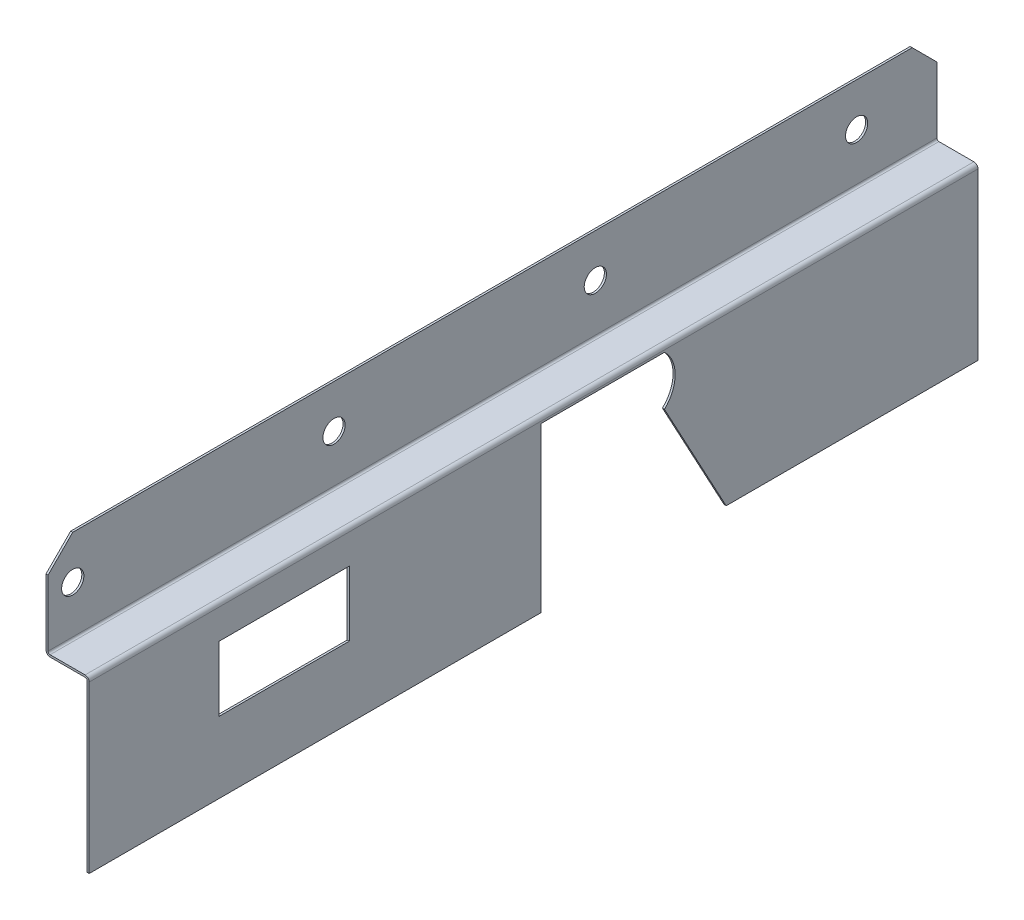
ISO-10303-21;
HEADER;
FILE_DESCRIPTION(('STEP AP214'),'2;1');
FILE_NAME('part.step','',(''),(''),'','','');
FILE_SCHEMA(('AUTOMOTIVE_DESIGN { 1 0 10303 214 1 1 1 1 }'));
ENDSEC;
DATA;
#1=APPLICATION_CONTEXT('core data for automotive mechanical design processes');
#2=APPLICATION_PROTOCOL_DEFINITION('international standard','automotive_design',2000,#1);
#3=PRODUCT_CONTEXT('',#1,'mechanical');
#4=PRODUCT('Part','Part','',(#3));
#5=PRODUCT_RELATED_PRODUCT_CATEGORY('part','',(#4));
#6=PRODUCT_DEFINITION_FORMATION('','',#4);
#7=PRODUCT_DEFINITION_CONTEXT('part definition',#1,'design');
#8=PRODUCT_DEFINITION('design','',#6,#7);
#9=PRODUCT_DEFINITION_SHAPE('','',#8);
#10=(LENGTH_UNIT() NAMED_UNIT(*) SI_UNIT(.MILLI.,.METRE.));
#11=(NAMED_UNIT(*) PLANE_ANGLE_UNIT() SI_UNIT($,.RADIAN.));
#12=(NAMED_UNIT(*) SI_UNIT($,.STERADIAN.) SOLID_ANGLE_UNIT());
#13=UNCERTAINTY_MEASURE_WITH_UNIT(LENGTH_MEASURE(1.E-05),#10,'distance_accuracy_value','');
#14=(GEOMETRIC_REPRESENTATION_CONTEXT(3) GLOBAL_UNCERTAINTY_ASSIGNED_CONTEXT((#13)) GLOBAL_UNIT_ASSIGNED_CONTEXT((#10,
#11,#12)) REPRESENTATION_CONTEXT('',''));
#15=CARTESIAN_POINT('',(0.,0.,0.));
#16=DIRECTION('',(0.,0.,1.));
#17=DIRECTION('',(1.,0.,0.));
#18=AXIS2_PLACEMENT_3D('',#15,#16,#17);
#19=CARTESIAN_POINT('',(0.5,0.5,0.));
#20=DIRECTION('',(0.,0.,-1.));
#21=DIRECTION('',(-1.,0.,0.));
#22=AXIS2_PLACEMENT_3D('',#19,#20,#21);
#23=CYLINDRICAL_SURFACE('',#22,1.);
#24=DIRECTION('',(0.,0.,-1.));
#25=VECTOR('',#24,1.);
#26=CARTESIAN_POINT('',(0.5,-0.5,-108.));
#27=LINE('',#26,#25);
#28=CARTESIAN_POINT('',(0.5,-0.5,108.));
#29=VERTEX_POINT('',#28);
#30=CARTESIAN_POINT('',(0.5,-0.5,-108.));
#31=VERTEX_POINT('',#30);
#32=EDGE_CURVE('E175',#29,#31,#27,.T.);
#33=ORIENTED_EDGE('',*,*,#32,.F.);
#34=CARTESIAN_POINT('',(0.5,0.5,108.));
#35=DIRECTION('',(0.,0.,-1.));
#36=DIRECTION('',(-1.,0.,0.));
#37=AXIS2_PLACEMENT_3D('',#34,#35,#36);
#38=CIRCLE('',#37,1.);
#39=CARTESIAN_POINT('',(-0.5,0.5,108.));
#40=VERTEX_POINT('',#39);
#41=EDGE_CURVE('E180',#29,#40,#38,.T.);
#42=ORIENTED_EDGE('',*,*,#41,.T.);
#43=DIRECTION('',(0.,0.,1.));
#44=VECTOR('',#43,1.);
#45=CARTESIAN_POINT('',(-0.5,0.5,-108.));
#46=LINE('',#45,#44);
#47=CARTESIAN_POINT('',(-0.5,0.5,-108.));
#48=VERTEX_POINT('',#47);
#49=EDGE_CURVE('E178',#48,#40,#46,.T.);
#50=ORIENTED_EDGE('',*,*,#49,.F.);
#51=CARTESIAN_POINT('',(0.5,0.5,-108.));
#52=DIRECTION('',(0.,0.,-1.));
#53=DIRECTION('',(-1.,0.,0.));
#54=AXIS2_PLACEMENT_3D('',#51,#52,#53);
#55=CIRCLE('',#54,1.);
#56=EDGE_CURVE('E21',#48,#31,#55,.F.);
#57=ORIENTED_EDGE('',*,*,#56,.T.);
#58=EDGE_LOOP('',(#33,#42,#50,#57));
#59=FACE_BOUND('',#58,.T.);
#60=ADVANCED_FACE('F17',(#59),#23,.T.);
#61=CARTESIAN_POINT('',(2.73990850376749,19.52,105.));
#62=DIRECTION('',(0.,0.707106781186549,0.707106781186546));
#63=DIRECTION('',(0.,-0.707106781186546,0.707106781186549));
#64=AXIS2_PLACEMENT_3D('',#61,#62,#63);
#65=PLANE('',#64);
#66=DIRECTION('',(0.,0.707106781186549,-0.707106781186546));
#67=VECTOR('',#66,1.);
#68=CARTESIAN_POINT('',(-0.5,16.52,108.));
#69=LINE('',#68,#67);
#70=CARTESIAN_POINT('',(-0.5,16.52,108.));
#71=VERTEX_POINT('',#70);
#72=CARTESIAN_POINT('',(-0.5,22.52,102.));
#73=VERTEX_POINT('',#72);
#74=EDGE_CURVE('E283',#71,#73,#69,.T.);
#75=ORIENTED_EDGE('',*,*,#74,.F.);
#76=DIRECTION('',(1.,0.,0.));
#77=VECTOR('',#76,1.);
#78=CARTESIAN_POINT('',(2.73990850376749,16.52,108.));
#79=LINE('',#78,#77);
#80=CARTESIAN_POINT('',(0.,16.52,108.));
#81=VERTEX_POINT('',#80);
#82=EDGE_CURVE('E326',#71,#81,#79,.T.);
#83=ORIENTED_EDGE('',*,*,#82,.T.);
#84=DIRECTION('',(0.,-0.707106781186549,0.707106781186546));
#85=VECTOR('',#84,1.);
#86=CARTESIAN_POINT('',(0.,22.52,102.));
#87=LINE('',#86,#85);
#88=CARTESIAN_POINT('',(0.,22.52,102.));
#89=VERTEX_POINT('',#88);
#90=EDGE_CURVE('E264',#89,#81,#87,.T.);
#91=ORIENTED_EDGE('',*,*,#90,.F.);
#92=DIRECTION('',(1.,0.,0.));
#93=VECTOR('',#92,1.);
#94=CARTESIAN_POINT('',(-0.5,22.52,102.));
#95=LINE('',#94,#93);
#96=EDGE_CURVE('E312',#73,#89,#95,.T.);
#97=ORIENTED_EDGE('',*,*,#96,.F.);
#98=EDGE_LOOP('',(#75,#83,#91,#97));
#99=FACE_BOUND('',#98,.T.);
#100=ADVANCED_FACE('F687',(#99),#65,.T.);
#101=CARTESIAN_POINT('',(0.5,0.5,0.));
#102=DIRECTION('',(0.,0.,-1.));
#103=DIRECTION('',(-1.,0.,0.));
#104=AXIS2_PLACEMENT_3D('',#101,#102,#103);
#105=CYLINDRICAL_SURFACE('',#104,0.5);
#106=CARTESIAN_POINT('',(0.5,0.5,108.));
#107=DIRECTION('',(0.,0.,-1.));
#108=DIRECTION('',(-1.,0.,0.));
#109=AXIS2_PLACEMENT_3D('',#106,#107,#108);
#110=CIRCLE('',#109,0.5);
#111=CARTESIAN_POINT('',(0.5,0.,108.));
#112=VERTEX_POINT('',#111);
#113=CARTESIAN_POINT('',(0.,0.5,108.));
#114=VERTEX_POINT('',#113);
#115=EDGE_CURVE('E313',#112,#114,#110,.T.);
#116=ORIENTED_EDGE('',*,*,#115,.F.);
#117=DIRECTION('',(0.,0.,1.));
#118=VECTOR('',#117,1.);
#119=CARTESIAN_POINT('',(0.5,0.,-108.));
#120=LINE('',#119,#118);
#121=CARTESIAN_POINT('',(0.5,0.,-108.));
#122=VERTEX_POINT('',#121);
#123=EDGE_CURVE('E188',#122,#112,#120,.T.);
#124=ORIENTED_EDGE('',*,*,#123,.F.);
#125=CARTESIAN_POINT('',(0.5,0.5,-108.));
#126=DIRECTION('',(0.,0.,-1.));
#127=DIRECTION('',(-1.,0.,0.));
#128=AXIS2_PLACEMENT_3D('',#125,#126,#127);
#129=CIRCLE('',#128,0.5);
#130=CARTESIAN_POINT('',(0.,0.5,-108.));
#131=VERTEX_POINT('',#130);
#132=EDGE_CURVE('E328',#131,#122,#129,.F.);
#133=ORIENTED_EDGE('',*,*,#132,.F.);
#134=DIRECTION('',(0.,0.,-1.));
#135=VECTOR('',#134,1.);
#136=CARTESIAN_POINT('',(0.,0.5,-108.));
#137=LINE('',#136,#135);
#138=EDGE_CURVE('E260',#114,#131,#137,.T.);
#139=ORIENTED_EDGE('',*,*,#138,.F.);
#140=EDGE_LOOP('',(#116,#124,#133,#139));
#141=FACE_BOUND('',#140,.T.);
#142=ADVANCED_FACE('F679',(#141),#105,.F.);
#143=CARTESIAN_POINT('',(2.73990850376749,19.52,-105.));
#144=DIRECTION('',(0.,0.707106781186546,-0.707106781186549));
#145=DIRECTION('',(0.,0.707106781186549,0.707106781186546));
#146=AXIS2_PLACEMENT_3D('',#143,#144,#145);
#147=PLANE('',#146);
#148=DIRECTION('',(0.,-0.707106781186548,-0.707106781186547));
#149=VECTOR('',#148,1.);
#150=CARTESIAN_POINT('',(-0.5,22.52,-102.));
#151=LINE('',#150,#149);
#152=CARTESIAN_POINT('',(-0.5,22.52,-102.));
#153=VERTEX_POINT('',#152);
#154=CARTESIAN_POINT('',(-0.5,16.52,-108.));
#155=VERTEX_POINT('',#154);
#156=EDGE_CURVE('E282',#153,#155,#151,.T.);
#157=ORIENTED_EDGE('',*,*,#156,.F.);
#158=DIRECTION('',(1.,0.,0.));
#159=VECTOR('',#158,1.);
#160=CARTESIAN_POINT('',(-0.5,22.52,-102.));
#161=LINE('',#160,#159);
#162=CARTESIAN_POINT('',(0.,22.52,-102.));
#163=VERTEX_POINT('',#162);
#164=EDGE_CURVE('E321',#163,#153,#161,.F.);
#165=ORIENTED_EDGE('',*,*,#164,.F.);
#166=DIRECTION('',(0.,0.707106781186548,0.707106781186547));
#167=VECTOR('',#166,1.);
#168=CARTESIAN_POINT('',(0.,16.52,-108.));
#169=LINE('',#168,#167);
#170=CARTESIAN_POINT('',(0.,16.52,-108.));
#171=VERTEX_POINT('',#170);
#172=EDGE_CURVE('E263',#171,#163,#169,.T.);
#173=ORIENTED_EDGE('',*,*,#172,.F.);
#174=DIRECTION('',(1.,0.,0.));
#175=VECTOR('',#174,1.);
#176=CARTESIAN_POINT('',(2.73990850376749,16.52,-108.));
#177=LINE('',#176,#175);
#178=EDGE_CURVE('E310',#171,#155,#177,.F.);
#179=ORIENTED_EDGE('',*,*,#178,.T.);
#180=EDGE_LOOP('',(#157,#165,#173,#179));
#181=FACE_BOUND('',#180,.T.);
#182=ADVANCED_FACE('F671',(#181),#147,.T.);
#183=CARTESIAN_POINT('',(-0.5,22.52,-108.));
#184=DIRECTION('',(0.,1.,0.));
#185=DIRECTION('',(0.,0.,1.));
#186=AXIS2_PLACEMENT_3D('',#183,#184,#185);
#187=PLANE('',#186);
#188=ORIENTED_EDGE('',*,*,#164,.T.);
#189=DIRECTION('',(0.,0.,1.));
#190=VECTOR('',#189,1.);
#191=CARTESIAN_POINT('',(-0.5,22.52,-108.));
#192=LINE('',#191,#190);
#193=EDGE_CURVE('E286',#73,#153,#192,.F.);
#194=ORIENTED_EDGE('',*,*,#193,.F.);
#195=ORIENTED_EDGE('',*,*,#96,.T.);
#196=DIRECTION('',(0.,0.,-1.));
#197=VECTOR('',#196,1.);
#198=CARTESIAN_POINT('',(0.,22.52,-108.));
#199=LINE('',#198,#197);
#200=EDGE_CURVE('E291',#163,#89,#199,.F.);
#201=ORIENTED_EDGE('',*,*,#200,.F.);
#202=EDGE_LOOP('',(#188,#194,#195,#201));
#203=FACE_BOUND('',#202,.T.);
#204=ADVANCED_FACE('F663',(#203),#187,.T.);
#205=CARTESIAN_POINT('',(0.,12.02,-88.5));
#206=DIRECTION('',(-1.,0.,0.));
#207=DIRECTION('',(0.,0.,1.));
#208=AXIS2_PLACEMENT_3D('',#205,#206,#207);
#209=CYLINDRICAL_SURFACE('',#208,2.7);
#210=CARTESIAN_POINT('',(-0.5,12.02,-88.5));
#211=DIRECTION('',(-1.,0.,0.));
#212=DIRECTION('',(0.,0.,1.));
#213=AXIS2_PLACEMENT_3D('',#210,#211,#212);
#214=CIRCLE('',#213,2.7);
#215=CARTESIAN_POINT('',(-0.5,12.02,-85.8));
#216=VERTEX_POINT('',#215);
#217=EDGE_CURVE('E281',#216,#216,#214,.F.);
#218=ORIENTED_EDGE('',*,*,#217,.F.);
#219=EDGE_LOOP('',(#218));
#220=FACE_BOUND('',#219,.T.);
#221=CARTESIAN_POINT('',(0.,12.02,-88.5));
#222=DIRECTION('',(-1.,0.,0.));
#223=DIRECTION('',(0.,0.,1.));
#224=AXIS2_PLACEMENT_3D('',#221,#222,#223);
#225=CIRCLE('',#224,2.7);
#226=CARTESIAN_POINT('',(0.,12.02,-85.8));
#227=VERTEX_POINT('',#226);
#228=EDGE_CURVE('E318',#227,#227,#225,.T.);
#229=ORIENTED_EDGE('',*,*,#228,.F.);
#230=EDGE_LOOP('',(#229));
#231=FACE_BOUND('',#230,.T.);
#232=ADVANCED_FACE('F655',(#220,#231),#209,.F.);
#233=CARTESIAN_POINT('',(0.,12.02,-25.));
#234=DIRECTION('',(-1.,0.,0.));
#235=DIRECTION('',(0.,0.,1.));
#236=AXIS2_PLACEMENT_3D('',#233,#234,#235);
#237=CYLINDRICAL_SURFACE('',#236,2.7);
#238=CARTESIAN_POINT('',(-0.5,12.02,-25.));
#239=DIRECTION('',(-1.,0.,0.));
#240=DIRECTION('',(0.,0.,1.));
#241=AXIS2_PLACEMENT_3D('',#238,#239,#240);
#242=CIRCLE('',#241,2.7);
#243=CARTESIAN_POINT('',(-0.5,12.02,-22.3));
#244=VERTEX_POINT('',#243);
#245=EDGE_CURVE('E367',#244,#244,#242,.F.);
#246=ORIENTED_EDGE('',*,*,#245,.F.);
#247=EDGE_LOOP('',(#246));
#248=FACE_BOUND('',#247,.T.);
#249=CARTESIAN_POINT('',(0.,12.02,-25.));
#250=DIRECTION('',(-1.,0.,0.));
#251=DIRECTION('',(0.,0.,1.));
#252=AXIS2_PLACEMENT_3D('',#249,#250,#251);
#253=CIRCLE('',#252,2.7);
#254=CARTESIAN_POINT('',(0.,12.02,-22.3));
#255=VERTEX_POINT('',#254);
#256=EDGE_CURVE('E357',#255,#255,#253,.T.);
#257=ORIENTED_EDGE('',*,*,#256,.F.);
#258=EDGE_LOOP('',(#257));
#259=FACE_BOUND('',#258,.T.);
#260=ADVANCED_FACE('F648',(#248,#259),#237,.F.);
#261=CARTESIAN_POINT('',(0.,12.02,38.5));
#262=DIRECTION('',(-1.,0.,0.));
#263=DIRECTION('',(0.,0.,1.));
#264=AXIS2_PLACEMENT_3D('',#261,#262,#263);
#265=CYLINDRICAL_SURFACE('',#264,2.7);
#266=CARTESIAN_POINT('',(-0.5,12.02,38.5));
#267=DIRECTION('',(-1.,0.,0.));
#268=DIRECTION('',(0.,0.,1.));
#269=AXIS2_PLACEMENT_3D('',#266,#267,#268);
#270=CIRCLE('',#269,2.7);
#271=CARTESIAN_POINT('',(-0.5,12.02,41.2));
#272=VERTEX_POINT('',#271);
#273=EDGE_CURVE('E364',#272,#272,#270,.F.);
#274=ORIENTED_EDGE('',*,*,#273,.F.);
#275=EDGE_LOOP('',(#274));
#276=FACE_BOUND('',#275,.T.);
#277=CARTESIAN_POINT('',(0.,12.02,38.5));
#278=DIRECTION('',(-1.,0.,0.));
#279=DIRECTION('',(0.,0.,1.));
#280=AXIS2_PLACEMENT_3D('',#277,#278,#279);
#281=CIRCLE('',#280,2.7);
#282=CARTESIAN_POINT('',(0.,12.02,41.2));
#283=VERTEX_POINT('',#282);
#284=EDGE_CURVE('E354',#283,#283,#281,.T.);
#285=ORIENTED_EDGE('',*,*,#284,.F.);
#286=EDGE_LOOP('',(#285));
#287=FACE_BOUND('',#286,.T.);
#288=ADVANCED_FACE('F641',(#276,#287),#265,.F.);
#289=CARTESIAN_POINT('',(0.,12.02,102.));
#290=DIRECTION('',(-1.,0.,0.));
#291=DIRECTION('',(0.,0.,1.));
#292=AXIS2_PLACEMENT_3D('',#289,#290,#291);
#293=CYLINDRICAL_SURFACE('',#292,2.7);
#294=CARTESIAN_POINT('',(-0.5,12.02,102.));
#295=DIRECTION('',(-1.,0.,0.));
#296=DIRECTION('',(0.,0.,1.));
#297=AXIS2_PLACEMENT_3D('',#294,#295,#296);
#298=CIRCLE('',#297,2.7);
#299=CARTESIAN_POINT('',(-0.5,12.02,104.7));
#300=VERTEX_POINT('',#299);
#301=EDGE_CURVE('E279',#300,#300,#298,.F.);
#302=ORIENTED_EDGE('',*,*,#301,.F.);
#303=EDGE_LOOP('',(#302));
#304=FACE_BOUND('',#303,.T.);
#305=CARTESIAN_POINT('',(0.,12.02,102.));
#306=DIRECTION('',(-1.,0.,0.));
#307=DIRECTION('',(0.,0.,1.));
#308=AXIS2_PLACEMENT_3D('',#305,#306,#307);
#309=CIRCLE('',#308,2.7);
#310=CARTESIAN_POINT('',(0.,12.02,104.7));
#311=VERTEX_POINT('',#310);
#312=EDGE_CURVE('E276',#311,#311,#309,.T.);
#313=ORIENTED_EDGE('',*,*,#312,.F.);
#314=EDGE_LOOP('',(#313));
#315=FACE_BOUND('',#314,.T.);
#316=ADVANCED_FACE('F19',(#304,#315),#293,.F.);
#317=CARTESIAN_POINT('',(9.,-1.,0.));
#318=DIRECTION('',(0.,0.,1.));
#319=DIRECTION('',(1.,0.,0.));
#320=AXIS2_PLACEMENT_3D('',#317,#318,#319);
#321=CYLINDRICAL_SURFACE('',#320,0.5);
#322=CARTESIAN_POINT('',(9.,-1.,-108.));
#323=DIRECTION('',(0.,0.,1.));
#324=DIRECTION('',(1.,0.,0.));
#325=AXIS2_PLACEMENT_3D('',#322,#323,#324);
#326=CIRCLE('',#325,0.5);
#327=CARTESIAN_POINT('',(9.5,-1.,-108.));
#328=VERTEX_POINT('',#327);
#329=CARTESIAN_POINT('',(9.,-0.5,-108.));
#330=VERTEX_POINT('',#329);
#331=EDGE_CURVE('E194',#328,#330,#326,.T.);
#332=ORIENTED_EDGE('',*,*,#331,.F.);
#333=DIRECTION('',(0.,0.,1.));
#334=VECTOR('',#333,1.);
#335=CARTESIAN_POINT('',(9.5,-1.,-108.));
#336=LINE('',#335,#334);
#337=CARTESIAN_POINT('',(9.5,-1.,108.));
#338=VERTEX_POINT('',#337);
#339=EDGE_CURVE('E257',#338,#328,#336,.F.);
#340=ORIENTED_EDGE('',*,*,#339,.F.);
#341=CARTESIAN_POINT('',(9.,-1.,108.));
#342=DIRECTION('',(0.,0.,1.));
#343=DIRECTION('',(1.,0.,0.));
#344=AXIS2_PLACEMENT_3D('',#341,#342,#343);
#345=CIRCLE('',#344,0.5);
#346=CARTESIAN_POINT('',(9.,-0.5,108.));
#347=VERTEX_POINT('',#346);
#348=EDGE_CURVE('E323',#347,#338,#345,.F.);
#349=ORIENTED_EDGE('',*,*,#348,.F.);
#350=DIRECTION('',(0.,0.,-1.));
#351=VECTOR('',#350,1.);
#352=CARTESIAN_POINT('',(9.,-0.5,-108.));
#353=LINE('',#352,#351);
#354=EDGE_CURVE('E189',#330,#347,#353,.F.);
#355=ORIENTED_EDGE('',*,*,#354,.F.);
#356=EDGE_LOOP('',(#332,#340,#349,#355));
#357=FACE_BOUND('',#356,.T.);
#358=ADVANCED_FACE('F442',(#357),#321,.F.);
#359=CARTESIAN_POINT('',(-0.5,-0.5,-108.));
#360=DIRECTION('',(-1.,0.,0.));
#361=DIRECTION('',(0.,0.,1.));
#362=AXIS2_PLACEMENT_3D('',#359,#360,#361);
#363=PLANE('',#362);
#364=ORIENTED_EDGE('',*,*,#301,.T.);
#365=EDGE_LOOP('',(#364));
#366=FACE_BOUND('',#365,.T.);
#367=ORIENTED_EDGE('',*,*,#273,.T.);
#368=EDGE_LOOP('',(#367));
#369=FACE_BOUND('',#368,.T.);
#370=ORIENTED_EDGE('',*,*,#245,.T.);
#371=EDGE_LOOP('',(#370));
#372=FACE_BOUND('',#371,.T.);
#373=ORIENTED_EDGE('',*,*,#217,.T.);
#374=EDGE_LOOP('',(#373));
#375=FACE_BOUND('',#374,.T.);
#376=ORIENTED_EDGE('',*,*,#49,.T.);
#377=DIRECTION('',(0.,1.,0.));
#378=VECTOR('',#377,1.);
#379=CARTESIAN_POINT('',(-0.5,-8.16018299246501,108.));
#380=LINE('',#379,#378);
#381=EDGE_CURVE('E349',#71,#40,#380,.F.);
#382=ORIENTED_EDGE('',*,*,#381,.F.);
#383=ORIENTED_EDGE('',*,*,#74,.T.);
#384=ORIENTED_EDGE('',*,*,#193,.T.);
#385=ORIENTED_EDGE('',*,*,#156,.T.);
#386=DIRECTION('',(0.,1.,0.));
#387=VECTOR('',#386,1.);
#388=CARTESIAN_POINT('',(-0.5,-8.16018299246501,-108.));
#389=LINE('',#388,#387);
#390=EDGE_CURVE('E197',#155,#48,#389,.F.);
#391=ORIENTED_EDGE('',*,*,#390,.T.);
#392=EDGE_LOOP('',(#376,#382,#383,#384,#385,#391));
#393=FACE_BOUND('',#392,.T.);
#394=ADVANCED_FACE('F379',(#366,#369,#372,#375,#393),#363,.T.);
#395=CARTESIAN_POINT('',(9.5,-0.5,-108.));
#396=DIRECTION('',(0.,-1.,0.));
#397=DIRECTION('',(0.,0.,-1.));
#398=AXIS2_PLACEMENT_3D('',#395,#396,#397);
#399=PLANE('',#398);
#400=ORIENTED_EDGE('',*,*,#32,.T.);
#401=DIRECTION('',(1.,0.,0.));
#402=VECTOR('',#401,1.);
#403=CARTESIAN_POINT('',(5.97981700753498,-0.5,-108.));
#404=LINE('',#403,#402);
#405=EDGE_CURVE('E185',#31,#330,#404,.T.);
#406=ORIENTED_EDGE('',*,*,#405,.T.);
#407=ORIENTED_EDGE('',*,*,#354,.T.);
#408=DIRECTION('',(1.,0.,0.));
#409=VECTOR('',#408,1.);
#410=CARTESIAN_POINT('',(5.97981700753498,-0.5,108.));
#411=LINE('',#410,#409);
#412=EDGE_CURVE('E187',#29,#347,#411,.T.);
#413=ORIENTED_EDGE('',*,*,#412,.F.);
#414=EDGE_LOOP('',(#400,#406,#407,#413));
#415=FACE_BOUND('',#414,.T.);
#416=ADVANCED_FACE('F183',(#415),#399,.T.);
#417=CARTESIAN_POINT('',(0.,0.,-108.));
#418=DIRECTION('',(0.,1.,0.));
#419=DIRECTION('',(0.,0.,1.));
#420=AXIS2_PLACEMENT_3D('',#417,#418,#419);
#421=PLANE('',#420);
#422=ORIENTED_EDGE('',*,*,#123,.T.);
#423=DIRECTION('',(1.,0.,0.));
#424=VECTOR('',#423,1.);
#425=CARTESIAN_POINT('',(5.97981700753498,0.,108.));
#426=LINE('',#425,#424);
#427=CARTESIAN_POINT('',(9.,0.,108.));
#428=VERTEX_POINT('',#427);
#429=EDGE_CURVE('E345',#428,#112,#426,.F.);
#430=ORIENTED_EDGE('',*,*,#429,.F.);
#431=DIRECTION('',(0.,0.,1.));
#432=VECTOR('',#431,1.);
#433=CARTESIAN_POINT('',(9.,0.,0.));
#434=LINE('',#433,#432);
#435=CARTESIAN_POINT('',(9.,0.,-108.));
#436=VERTEX_POINT('',#435);
#437=EDGE_CURVE('E271',#436,#428,#434,.T.);
#438=ORIENTED_EDGE('',*,*,#437,.F.);
#439=DIRECTION('',(1.,0.,0.));
#440=VECTOR('',#439,1.);
#441=CARTESIAN_POINT('',(5.97981700753498,0.,-108.));
#442=LINE('',#441,#440);
#443=EDGE_CURVE('E209',#436,#122,#442,.F.);
#444=ORIENTED_EDGE('',*,*,#443,.T.);
#445=EDGE_LOOP('',(#422,#430,#438,#444));
#446=FACE_BOUND('',#445,.T.);
#447=ADVANCED_FACE('F418',(#446),#421,.T.);
#448=CARTESIAN_POINT('',(0.,22.52,-108.));
#449=DIRECTION('',(1.,0.,0.));
#450=DIRECTION('',(0.,0.,-1.));
#451=AXIS2_PLACEMENT_3D('',#448,#449,#450);
#452=PLANE('',#451);
#453=ORIENTED_EDGE('',*,*,#312,.T.);
#454=EDGE_LOOP('',(#453));
#455=FACE_BOUND('',#454,.T.);
#456=ORIENTED_EDGE('',*,*,#284,.T.);
#457=EDGE_LOOP('',(#456));
#458=FACE_BOUND('',#457,.T.);
#459=ORIENTED_EDGE('',*,*,#256,.T.);
#460=EDGE_LOOP('',(#459));
#461=FACE_BOUND('',#460,.T.);
#462=ORIENTED_EDGE('',*,*,#228,.T.);
#463=EDGE_LOOP('',(#462));
#464=FACE_BOUND('',#463,.T.);
#465=ORIENTED_EDGE('',*,*,#172,.T.);
#466=ORIENTED_EDGE('',*,*,#200,.T.);
#467=ORIENTED_EDGE('',*,*,#90,.T.);
#468=DIRECTION('',(0.,1.,0.));
#469=VECTOR('',#468,1.);
#470=CARTESIAN_POINT('',(0.,-8.16018299246501,108.));
#471=LINE('',#470,#469);
#472=EDGE_CURVE('E247',#114,#81,#471,.T.);
#473=ORIENTED_EDGE('',*,*,#472,.F.);
#474=ORIENTED_EDGE('',*,*,#138,.T.);
#475=DIRECTION('',(0.,1.,0.));
#476=VECTOR('',#475,1.);
#477=CARTESIAN_POINT('',(0.,-8.16018299246501,-108.));
#478=LINE('',#477,#476);
#479=EDGE_CURVE('E274',#131,#171,#478,.T.);
#480=ORIENTED_EDGE('',*,*,#479,.T.);
#481=EDGE_LOOP('',(#465,#466,#467,#473,#474,#480));
#482=FACE_BOUND('',#481,.T.);
#483=ADVANCED_FACE('F602',(#455,#458,#461,#464,#482),#452,.T.);
#484=CARTESIAN_POINT('',(9.5,-41.3,-108.));
#485=DIRECTION('',(-1.,0.,0.));
#486=DIRECTION('',(0.,0.,1.));
#487=AXIS2_PLACEMENT_3D('',#484,#485,#486);
#488=PLANE('',#487);
#489=DIRECTION('',(0.,1.,0.));
#490=VECTOR('',#489,1.);
#491=CARTESIAN_POINT('',(9.5,-24.,44.8));
#492=LINE('',#491,#490);
#493=CARTESIAN_POINT('',(9.5,-24.,44.8));
#494=VERTEX_POINT('',#493);
#495=CARTESIAN_POINT('',(9.5,-8.19999999999999,44.8));
#496=VERTEX_POINT('',#495);
#497=EDGE_CURVE('E463',#494,#496,#492,.T.);
#498=ORIENTED_EDGE('',*,*,#497,.T.);
#499=DIRECTION('',(0.,0.,1.));
#500=VECTOR('',#499,1.);
#501=CARTESIAN_POINT('',(9.5,-8.19999999999999,44.8));
#502=LINE('',#501,#500);
#503=CARTESIAN_POINT('',(9.5,-8.19999999999999,76.4));
#504=VERTEX_POINT('',#503);
#505=EDGE_CURVE('E458',#496,#504,#502,.T.);
#506=ORIENTED_EDGE('',*,*,#505,.T.);
#507=DIRECTION('',(0.,1.,0.));
#508=VECTOR('',#507,1.);
#509=CARTESIAN_POINT('',(9.5,-8.19999999999999,76.4));
#510=LINE('',#509,#508);
#511=CARTESIAN_POINT('',(9.5,-24.,76.4));
#512=VERTEX_POINT('',#511);
#513=EDGE_CURVE('E253',#504,#512,#510,.F.);
#514=ORIENTED_EDGE('',*,*,#513,.T.);
#515=DIRECTION('',(0.,0.,-1.));
#516=VECTOR('',#515,1.);
#517=CARTESIAN_POINT('',(9.5,-24.,76.4));
#518=LINE('',#517,#516);
#519=EDGE_CURVE('E240',#512,#494,#518,.T.);
#520=ORIENTED_EDGE('',*,*,#519,.T.);
#521=EDGE_LOOP('',(#498,#506,#514,#520));
#522=FACE_BOUND('',#521,.T.);
#523=CARTESIAN_POINT('',(9.5,-7.5,-26.1789230769231));
#524=DIRECTION('',(-1.,0.,0.));
#525=DIRECTION('',(0.,0.,1.));
#526=AXIS2_PLACEMENT_3D('',#523,#524,#525);
#527=CIRCLE('',#526,8.22307692307693);
#528=CARTESIAN_POINT('',(9.5,-13.5,-31.802));
#529=VERTEX_POINT('',#528);
#530=CARTESIAN_POINT('',(9.5,-1.49999999999999,-31.802));
#531=VERTEX_POINT('',#530);
#532=EDGE_CURVE('E227',#529,#531,#527,.F.);
#533=ORIENTED_EDGE('',*,*,#532,.T.);
#534=DIRECTION('',(0.,0.,1.));
#535=VECTOR('',#534,1.);
#536=CARTESIAN_POINT('',(9.5,-1.49999999999999,-31.802));
#537=LINE('',#536,#535);
#538=CARTESIAN_POINT('',(9.5,-1.49999999999999,-1.80199999999999));
#539=VERTEX_POINT('',#538);
#540=EDGE_CURVE('E230',#531,#539,#537,.T.);
#541=ORIENTED_EDGE('',*,*,#540,.T.);
#542=DIRECTION('',(0.,1.,0.));
#543=VECTOR('',#542,1.);
#544=CARTESIAN_POINT('',(9.5,-1.49999999999999,-1.80199999999999));
#545=LINE('',#544,#543);
#546=CARTESIAN_POINT('',(9.5,-41.3,-1.802));
#547=VERTEX_POINT('',#546);
#548=EDGE_CURVE('E233',#539,#547,#545,.F.);
#549=ORIENTED_EDGE('',*,*,#548,.T.);
#550=DIRECTION('',(0.,0.,-1.));
#551=VECTOR('',#550,1.);
#552=CARTESIAN_POINT('',(9.5,-41.3,-108.));
#553=LINE('',#552,#551);
#554=CARTESIAN_POINT('',(9.5,-41.3,108.));
#555=VERTEX_POINT('',#554);
#556=EDGE_CURVE('E250',#555,#547,#553,.T.);
#557=ORIENTED_EDGE('',*,*,#556,.F.);
#558=DIRECTION('',(0.,1.,0.));
#559=VECTOR('',#558,1.);
#560=CARTESIAN_POINT('',(9.5,-8.16018299246501,108.));
#561=LINE('',#560,#559);
#562=EDGE_CURVE('E346',#338,#555,#561,.F.);
#563=ORIENTED_EDGE('',*,*,#562,.F.);
#564=ORIENTED_EDGE('',*,*,#339,.T.);
#565=DIRECTION('',(0.,1.,0.));
#566=VECTOR('',#565,1.);
#567=CARTESIAN_POINT('',(9.5,-8.16018299246501,-108.));
#568=LINE('',#567,#566);
#569=CARTESIAN_POINT('',(9.5,-41.3,-108.));
#570=VERTEX_POINT('',#569);
#571=EDGE_CURVE('E196',#328,#570,#568,.F.);
#572=ORIENTED_EDGE('',*,*,#571,.T.);
#573=DIRECTION('',(0.,0.,-1.));
#574=VECTOR('',#573,1.);
#575=CARTESIAN_POINT('',(9.5,-41.3,-108.));
#576=LINE('',#575,#574);
#577=CARTESIAN_POINT('',(9.5,-41.3,-46.802));
#578=VERTEX_POINT('',#577);
#579=EDGE_CURVE('E201',#578,#570,#576,.T.);
#580=ORIENTED_EDGE('',*,*,#579,.F.);
#581=DIRECTION('',(0.,0.880064172641751,0.474854769411017));
#582=VECTOR('',#581,1.);
#583=CARTESIAN_POINT('',(9.5,-41.3,-46.802));
#584=LINE('',#583,#582);
#585=EDGE_CURVE('E222',#578,#529,#584,.T.);
#586=ORIENTED_EDGE('',*,*,#585,.T.);
#587=EDGE_LOOP('',(#533,#541,#549,#557,#563,#564,#572,#580,#586));
#588=FACE_BOUND('',#587,.T.);
#589=ADVANCED_FACE('F436',(#522,#588),#488,.T.);
#590=CARTESIAN_POINT('',(10.,-1.49999999999999,-1.80199999999999));
#591=DIRECTION('',(0.,0.,1.));
#592=DIRECTION('',(1.,0.,0.));
#593=AXIS2_PLACEMENT_3D('',#590,#591,#592);
#594=PLANE('',#593);
#595=DIRECTION('',(1.,0.,0.));
#596=VECTOR('',#595,1.);
#597=CARTESIAN_POINT('',(10.,-1.49999999999999,-1.80199999999999));
#598=LINE('',#597,#596);
#599=CARTESIAN_POINT('',(10.,-1.49999999999999,-1.802));
#600=VERTEX_POINT('',#599);
#601=EDGE_CURVE('E231',#539,#600,#598,.T.);
#602=ORIENTED_EDGE('',*,*,#601,.T.);
#603=DIRECTION('',(0.,1.,0.));
#604=VECTOR('',#603,1.);
#605=CARTESIAN_POINT('',(10.,0.,-1.802));
#606=LINE('',#605,#604);
#607=CARTESIAN_POINT('',(10.,-41.3,-1.802));
#608=VERTEX_POINT('',#607);
#609=EDGE_CURVE('E236',#608,#600,#606,.T.);
#610=ORIENTED_EDGE('',*,*,#609,.F.);
#611=DIRECTION('',(1.,0.,0.));
#612=VECTOR('',#611,1.);
#613=CARTESIAN_POINT('',(10.,-41.3,-1.802));
#614=LINE('',#613,#612);
#615=EDGE_CURVE('E243',#547,#608,#614,.T.);
#616=ORIENTED_EDGE('',*,*,#615,.F.);
#617=ORIENTED_EDGE('',*,*,#548,.F.);
#618=EDGE_LOOP('',(#602,#610,#616,#617));
#619=FACE_BOUND('',#618,.T.);
#620=ADVANCED_FACE('F587',(#619),#594,.F.);
#621=CARTESIAN_POINT('',(10.,-1.49999999999999,-31.802));
#622=DIRECTION('',(0.,1.,0.));
#623=DIRECTION('',(0.,0.,1.));
#624=AXIS2_PLACEMENT_3D('',#621,#622,#623);
#625=PLANE('',#624);
#626=DIRECTION('',(-1.,0.,0.));
#627=VECTOR('',#626,1.);
#628=CARTESIAN_POINT('',(10.,-1.49999999999999,-31.802));
#629=LINE('',#628,#627);
#630=CARTESIAN_POINT('',(10.,-1.49999999999999,-31.802));
#631=VERTEX_POINT('',#630);
#632=EDGE_CURVE('E228',#531,#631,#629,.F.);
#633=ORIENTED_EDGE('',*,*,#632,.T.);
#634=DIRECTION('',(0.,0.,-1.));
#635=VECTOR('',#634,1.);
#636=CARTESIAN_POINT('',(10.,-1.49999999999999,-108.));
#637=LINE('',#636,#635);
#638=EDGE_CURVE('E239',#600,#631,#637,.T.);
#639=ORIENTED_EDGE('',*,*,#638,.F.);
#640=ORIENTED_EDGE('',*,*,#601,.F.);
#641=ORIENTED_EDGE('',*,*,#540,.F.);
#642=EDGE_LOOP('',(#633,#639,#640,#641));
#643=FACE_BOUND('',#642,.T.);
#644=ADVANCED_FACE('F579',(#643),#625,.F.);
#645=CARTESIAN_POINT('',(10.,-7.5,-26.1789230769231));
#646=DIRECTION('',(-1.,0.,0.));
#647=DIRECTION('',(0.,0.,1.));
#648=AXIS2_PLACEMENT_3D('',#645,#646,#647);
#649=CYLINDRICAL_SURFACE('',#648,8.22307692307693);
#650=DIRECTION('',(1.,0.,0.));
#651=VECTOR('',#650,1.);
#652=CARTESIAN_POINT('',(10.,-13.5,-31.802));
#653=LINE('',#652,#651);
#654=CARTESIAN_POINT('',(10.,-13.5,-31.802));
#655=VERTEX_POINT('',#654);
#656=EDGE_CURVE('E225',#529,#655,#653,.T.);
#657=ORIENTED_EDGE('',*,*,#656,.T.);
#658=CARTESIAN_POINT('',(10.,-7.5,-26.1789230769231));
#659=DIRECTION('',(-1.,0.,0.));
#660=DIRECTION('',(0.,0.,1.));
#661=AXIS2_PLACEMENT_3D('',#658,#659,#660);
#662=CIRCLE('',#661,8.22307692307693);
#663=EDGE_CURVE('E339',#631,#655,#662,.T.);
#664=ORIENTED_EDGE('',*,*,#663,.F.);
#665=ORIENTED_EDGE('',*,*,#632,.F.);
#666=ORIENTED_EDGE('',*,*,#532,.F.);
#667=EDGE_LOOP('',(#657,#664,#665,#666));
#668=FACE_BOUND('',#667,.T.);
#669=ADVANCED_FACE('F571',(#668),#649,.F.);
#670=CARTESIAN_POINT('',(10.,-41.3,-46.802));
#671=DIRECTION('',(0.,0.474854769411017,-0.880064172641751));
#672=DIRECTION('',(0.,0.880064172641751,0.474854769411017));
#673=AXIS2_PLACEMENT_3D('',#670,#671,#672);
#674=PLANE('',#673);
#675=DIRECTION('',(1.,0.,0.));
#676=VECTOR('',#675,1.);
#677=CARTESIAN_POINT('',(10.,-41.3,-46.802));
#678=LINE('',#677,#676);
#679=CARTESIAN_POINT('',(10.,-41.3,-46.802));
#680=VERTEX_POINT('',#679);
#681=EDGE_CURVE('E219',#680,#578,#678,.F.);
#682=ORIENTED_EDGE('',*,*,#681,.F.);
#683=DIRECTION('',(0.,-0.880064172641751,-0.474854769411017));
#684=VECTOR('',#683,1.);
#685=CARTESIAN_POINT('',(10.,-13.5,-31.802));
#686=LINE('',#685,#684);
#687=EDGE_CURVE('E216',#655,#680,#686,.T.);
#688=ORIENTED_EDGE('',*,*,#687,.F.);
#689=ORIENTED_EDGE('',*,*,#656,.F.);
#690=ORIENTED_EDGE('',*,*,#585,.F.);
#691=EDGE_LOOP('',(#682,#688,#689,#690));
#692=FACE_BOUND('',#691,.T.);
#693=ADVANCED_FACE('F564',(#692),#674,.F.);
#694=CARTESIAN_POINT('',(10.,-41.3,-108.));
#695=DIRECTION('',(0.,-1.,0.));
#696=DIRECTION('',(0.,0.,-1.));
#697=AXIS2_PLACEMENT_3D('',#694,#695,#696);
#698=PLANE('',#697);
#699=DIRECTION('',(1.,0.,0.));
#700=VECTOR('',#699,1.);
#701=CARTESIAN_POINT('',(5.97981700753498,-41.3,-108.));
#702=LINE('',#701,#700);
#703=CARTESIAN_POINT('',(10.,-41.3,-108.));
#704=VERTEX_POINT('',#703);
#705=EDGE_CURVE('E199',#570,#704,#702,.T.);
#706=ORIENTED_EDGE('',*,*,#705,.T.);
#707=DIRECTION('',(0.,0.,-1.));
#708=VECTOR('',#707,1.);
#709=CARTESIAN_POINT('',(10.,-41.3,-108.));
#710=LINE('',#709,#708);
#711=EDGE_CURVE('E212',#680,#704,#710,.T.);
#712=ORIENTED_EDGE('',*,*,#711,.F.);
#713=ORIENTED_EDGE('',*,*,#681,.T.);
#714=ORIENTED_EDGE('',*,*,#579,.T.);
#715=EDGE_LOOP('',(#706,#712,#713,#714));
#716=FACE_BOUND('',#715,.T.);
#717=ADVANCED_FACE('F433',(#716),#698,.T.);
#718=CARTESIAN_POINT('',(5.97981700753498,-8.16018299246501,-108.));
#719=DIRECTION('',(0.,0.,1.));
#720=DIRECTION('',(1.,0.,0.));
#721=AXIS2_PLACEMENT_3D('',#718,#719,#720);
#722=PLANE('',#721);
#723=ORIENTED_EDGE('',*,*,#479,.F.);
#724=ORIENTED_EDGE('',*,*,#132,.T.);
#725=ORIENTED_EDGE('',*,*,#443,.F.);
#726=CARTESIAN_POINT('',(9.,-1.,-108.));
#727=DIRECTION('',(0.,0.,1.));
#728=DIRECTION('',(1.,0.,0.));
#729=AXIS2_PLACEMENT_3D('',#726,#727,#728);
#730=CIRCLE('',#729,1.);
#731=CARTESIAN_POINT('',(10.,-1.,-108.));
#732=VERTEX_POINT('',#731);
#733=EDGE_CURVE('E273',#732,#436,#730,.T.);
#734=ORIENTED_EDGE('',*,*,#733,.F.);
#735=DIRECTION('',(0.,1.,0.));
#736=VECTOR('',#735,1.);
#737=CARTESIAN_POINT('',(10.,0.,-108.));
#738=LINE('',#737,#736);
#739=EDGE_CURVE('E215',#704,#732,#738,.T.);
#740=ORIENTED_EDGE('',*,*,#739,.F.);
#741=ORIENTED_EDGE('',*,*,#705,.F.);
#742=ORIENTED_EDGE('',*,*,#571,.F.);
#743=ORIENTED_EDGE('',*,*,#331,.T.);
#744=ORIENTED_EDGE('',*,*,#405,.F.);
#745=ORIENTED_EDGE('',*,*,#56,.F.);
#746=ORIENTED_EDGE('',*,*,#390,.F.);
#747=ORIENTED_EDGE('',*,*,#178,.F.);
#748=EDGE_LOOP('',(#723,#724,#725,#734,#740,#741,#742,#743,#744,#745,#746,#747));
#749=FACE_BOUND('',#748,.T.);
#750=ADVANCED_FACE('F192',(#749),#722,.F.);
#751=CARTESIAN_POINT('',(9.,-1.,0.));
#752=DIRECTION('',(0.,0.,1.));
#753=DIRECTION('',(1.,0.,0.));
#754=AXIS2_PLACEMENT_3D('',#751,#752,#753);
#755=CYLINDRICAL_SURFACE('',#754,1.);
#756=DIRECTION('',(0.,0.,-1.));
#757=VECTOR('',#756,1.);
#758=CARTESIAN_POINT('',(10.,-1.,-108.));
#759=LINE('',#758,#757);
#760=CARTESIAN_POINT('',(10.,-1.,108.));
#761=VERTEX_POINT('',#760);
#762=EDGE_CURVE('E389',#732,#761,#759,.F.);
#763=ORIENTED_EDGE('',*,*,#762,.F.);
#764=ORIENTED_EDGE('',*,*,#733,.T.);
#765=ORIENTED_EDGE('',*,*,#437,.T.);
#766=CARTESIAN_POINT('',(9.,-1.,108.));
#767=DIRECTION('',(0.,0.,1.));
#768=DIRECTION('',(1.,0.,0.));
#769=AXIS2_PLACEMENT_3D('',#766,#767,#768);
#770=CIRCLE('',#769,1.);
#771=EDGE_CURVE('E342',#761,#428,#770,.T.);
#772=ORIENTED_EDGE('',*,*,#771,.F.);
#773=EDGE_LOOP('',(#763,#764,#765,#772));
#774=FACE_BOUND('',#773,.T.);
#775=ADVANCED_FACE('F425',(#774),#755,.T.);
#776=CARTESIAN_POINT('',(5.97981700753498,-8.16018299246501,108.));
#777=DIRECTION('',(0.,0.,1.));
#778=DIRECTION('',(1.,0.,0.));
#779=AXIS2_PLACEMENT_3D('',#776,#777,#778);
#780=PLANE('',#779);
#781=ORIENTED_EDGE('',*,*,#115,.T.);
#782=ORIENTED_EDGE('',*,*,#472,.T.);
#783=ORIENTED_EDGE('',*,*,#82,.F.);
#784=ORIENTED_EDGE('',*,*,#381,.T.);
#785=ORIENTED_EDGE('',*,*,#41,.F.);
#786=ORIENTED_EDGE('',*,*,#412,.T.);
#787=ORIENTED_EDGE('',*,*,#348,.T.);
#788=ORIENTED_EDGE('',*,*,#562,.T.);
#789=DIRECTION('',(1.,0.,0.));
#790=VECTOR('',#789,1.);
#791=CARTESIAN_POINT('',(10.,-41.3,108.));
#792=LINE('',#791,#790);
#793=CARTESIAN_POINT('',(10.,-41.3,108.));
#794=VERTEX_POINT('',#793);
#795=EDGE_CURVE('E246',#794,#555,#792,.F.);
#796=ORIENTED_EDGE('',*,*,#795,.F.);
#797=DIRECTION('',(0.,1.,0.));
#798=VECTOR('',#797,1.);
#799=CARTESIAN_POINT('',(10.,0.,108.));
#800=LINE('',#799,#798);
#801=EDGE_CURVE('E392',#761,#794,#800,.F.);
#802=ORIENTED_EDGE('',*,*,#801,.F.);
#803=ORIENTED_EDGE('',*,*,#771,.T.);
#804=ORIENTED_EDGE('',*,*,#429,.T.);
#805=EDGE_LOOP('',(#781,#782,#783,#784,#785,#786,#787,#788,#796,#802,#803,#804));
#806=FACE_BOUND('',#805,.T.);
#807=ADVANCED_FACE('F380',(#806),#780,.T.);
#808=CARTESIAN_POINT('',(10.,-41.3,-108.));
#809=DIRECTION('',(0.,-1.,0.));
#810=DIRECTION('',(0.,0.,-1.));
#811=AXIS2_PLACEMENT_3D('',#808,#809,#810);
#812=PLANE('',#811);
#813=ORIENTED_EDGE('',*,*,#795,.T.);
#814=ORIENTED_EDGE('',*,*,#556,.T.);
#815=ORIENTED_EDGE('',*,*,#615,.T.);
#816=DIRECTION('',(0.,0.,-1.));
#817=VECTOR('',#816,1.);
#818=CARTESIAN_POINT('',(10.,-41.3,-108.));
#819=LINE('',#818,#817);
#820=EDGE_CURVE('E395',#794,#608,#819,.T.);
#821=ORIENTED_EDGE('',*,*,#820,.F.);
#822=EDGE_LOOP('',(#813,#814,#815,#821));
#823=FACE_BOUND('',#822,.T.);
#824=ADVANCED_FACE('F447',(#823),#812,.T.);
#825=CARTESIAN_POINT('',(10.,-8.19999999999999,76.4));
#826=DIRECTION('',(0.,0.,1.));
#827=DIRECTION('',(1.,0.,0.));
#828=AXIS2_PLACEMENT_3D('',#825,#826,#827);
#829=PLANE('',#828);
#830=DIRECTION('',(1.,0.,0.));
#831=VECTOR('',#830,1.);
#832=CARTESIAN_POINT('',(10.,-8.19999999999999,76.4));
#833=LINE('',#832,#831);
#834=CARTESIAN_POINT('',(10.,-8.19999999999999,76.4));
#835=VERTEX_POINT('',#834);
#836=EDGE_CURVE('E456',#504,#835,#833,.T.);
#837=ORIENTED_EDGE('',*,*,#836,.T.);
#838=DIRECTION('',(0.,1.,0.));
#839=VECTOR('',#838,1.);
#840=CARTESIAN_POINT('',(10.,0.,76.4));
#841=LINE('',#840,#839);
#842=CARTESIAN_POINT('',(10.,-24.,76.4));
#843=VERTEX_POINT('',#842);
#844=EDGE_CURVE('E400',#843,#835,#841,.T.);
#845=ORIENTED_EDGE('',*,*,#844,.F.);
#846=DIRECTION('',(1.,0.,0.));
#847=VECTOR('',#846,1.);
#848=CARTESIAN_POINT('',(10.,-24.,76.4));
#849=LINE('',#848,#847);
#850=EDGE_CURVE('E467',#843,#512,#849,.F.);
#851=ORIENTED_EDGE('',*,*,#850,.T.);
#852=ORIENTED_EDGE('',*,*,#513,.F.);
#853=EDGE_LOOP('',(#837,#845,#851,#852));
#854=FACE_BOUND('',#853,.T.);
#855=ADVANCED_FACE('F498',(#854),#829,.F.);
#856=CARTESIAN_POINT('',(10.,-8.19999999999999,44.8));
#857=DIRECTION('',(0.,1.,0.));
#858=DIRECTION('',(0.,0.,1.));
#859=AXIS2_PLACEMENT_3D('',#856,#857,#858);
#860=PLANE('',#859);
#861=DIRECTION('',(-1.,0.,0.));
#862=VECTOR('',#861,1.);
#863=CARTESIAN_POINT('',(10.,-8.19999999999999,44.8));
#864=LINE('',#863,#862);
#865=CARTESIAN_POINT('',(10.,-8.19999999999999,44.8));
#866=VERTEX_POINT('',#865);
#867=EDGE_CURVE('E461',#496,#866,#864,.F.);
#868=ORIENTED_EDGE('',*,*,#867,.T.);
#869=DIRECTION('',(0.,0.,-1.));
#870=VECTOR('',#869,1.);
#871=CARTESIAN_POINT('',(10.,-8.19999999999999,-108.));
#872=LINE('',#871,#870);
#873=EDGE_CURVE('E481',#835,#866,#872,.T.);
#874=ORIENTED_EDGE('',*,*,#873,.F.);
#875=ORIENTED_EDGE('',*,*,#836,.F.);
#876=ORIENTED_EDGE('',*,*,#505,.F.);
#877=EDGE_LOOP('',(#868,#874,#875,#876));
#878=FACE_BOUND('',#877,.T.);
#879=ADVANCED_FACE('F490',(#878),#860,.F.);
#880=CARTESIAN_POINT('',(10.,-24.,44.8));
#881=DIRECTION('',(0.,0.,-1.));
#882=DIRECTION('',(-1.,0.,0.));
#883=AXIS2_PLACEMENT_3D('',#880,#881,#882);
#884=PLANE('',#883);
#885=DIRECTION('',(1.,0.,0.));
#886=VECTOR('',#885,1.);
#887=CARTESIAN_POINT('',(10.,-24.,44.8));
#888=LINE('',#887,#886);
#889=CARTESIAN_POINT('',(10.,-24.,44.8));
#890=VERTEX_POINT('',#889);
#891=EDGE_CURVE('E36',#494,#890,#888,.T.);
#892=ORIENTED_EDGE('',*,*,#891,.T.);
#893=DIRECTION('',(0.,1.,0.));
#894=VECTOR('',#893,1.);
#895=CARTESIAN_POINT('',(10.,0.,44.8));
#896=LINE('',#895,#894);
#897=EDGE_CURVE('E27',#866,#890,#896,.F.);
#898=ORIENTED_EDGE('',*,*,#897,.F.);
#899=ORIENTED_EDGE('',*,*,#867,.F.);
#900=ORIENTED_EDGE('',*,*,#497,.F.);
#901=EDGE_LOOP('',(#892,#898,#899,#900));
#902=FACE_BOUND('',#901,.T.);
#903=ADVANCED_FACE('F488',(#902),#884,.F.);
#904=CARTESIAN_POINT('',(10.,-24.,76.4));
#905=DIRECTION('',(0.,-1.,0.));
#906=DIRECTION('',(0.,0.,-1.));
#907=AXIS2_PLACEMENT_3D('',#904,#905,#906);
#908=PLANE('',#907);
#909=ORIENTED_EDGE('',*,*,#850,.F.);
#910=DIRECTION('',(0.,0.,-1.));
#911=VECTOR('',#910,1.);
#912=CARTESIAN_POINT('',(10.,-24.,-108.));
#913=LINE('',#912,#911);
#914=EDGE_CURVE('E11',#890,#843,#913,.F.);
#915=ORIENTED_EDGE('',*,*,#914,.F.);
#916=ORIENTED_EDGE('',*,*,#891,.F.);
#917=ORIENTED_EDGE('',*,*,#519,.F.);
#918=EDGE_LOOP('',(#909,#915,#916,#917));
#919=FACE_BOUND('',#918,.T.);
#920=ADVANCED_FACE('F496',(#919),#908,.F.);
#921=CARTESIAN_POINT('',(10.,0.,-108.));
#922=DIRECTION('',(1.,0.,0.));
#923=DIRECTION('',(0.,0.,-1.));
#924=AXIS2_PLACEMENT_3D('',#921,#922,#923);
#925=PLANE('',#924);
#926=ORIENTED_EDGE('',*,*,#897,.T.);
#927=ORIENTED_EDGE('',*,*,#914,.T.);
#928=ORIENTED_EDGE('',*,*,#844,.T.);
#929=ORIENTED_EDGE('',*,*,#873,.T.);
#930=EDGE_LOOP('',(#926,#927,#928,#929));
#931=FACE_BOUND('',#930,.T.);
#932=ORIENTED_EDGE('',*,*,#801,.T.);
#933=ORIENTED_EDGE('',*,*,#820,.T.);
#934=ORIENTED_EDGE('',*,*,#609,.T.);
#935=ORIENTED_EDGE('',*,*,#638,.T.);
#936=ORIENTED_EDGE('',*,*,#663,.T.);
#937=ORIENTED_EDGE('',*,*,#687,.T.);
#938=ORIENTED_EDGE('',*,*,#711,.T.);
#939=ORIENTED_EDGE('',*,*,#739,.T.);
#940=ORIENTED_EDGE('',*,*,#762,.T.);
#941=EDGE_LOOP('',(#932,#933,#934,#935,#936,#937,#938,#939,#940));
#942=FACE_BOUND('',#941,.T.);
#943=ADVANCED_FACE('F428',(#931,#942),#925,.T.);
#944=CLOSED_SHELL('',(#60,#100,#142,#182,#204,#232,#260,#288,#316,#358,#394,#416,#447,#483,#589,
#620,#644,#669,#693,#717,#750,#775,#807,#824,#855,#879,#903,#920,#943));
#945=MANIFOLD_SOLID_BREP('B1',#944);
#946=ADVANCED_BREP_SHAPE_REPRESENTATION('',(#18,#945),#14);
#947=SHAPE_DEFINITION_REPRESENTATION(#9,#946);
ENDSEC;
END-ISO-10303-21;
